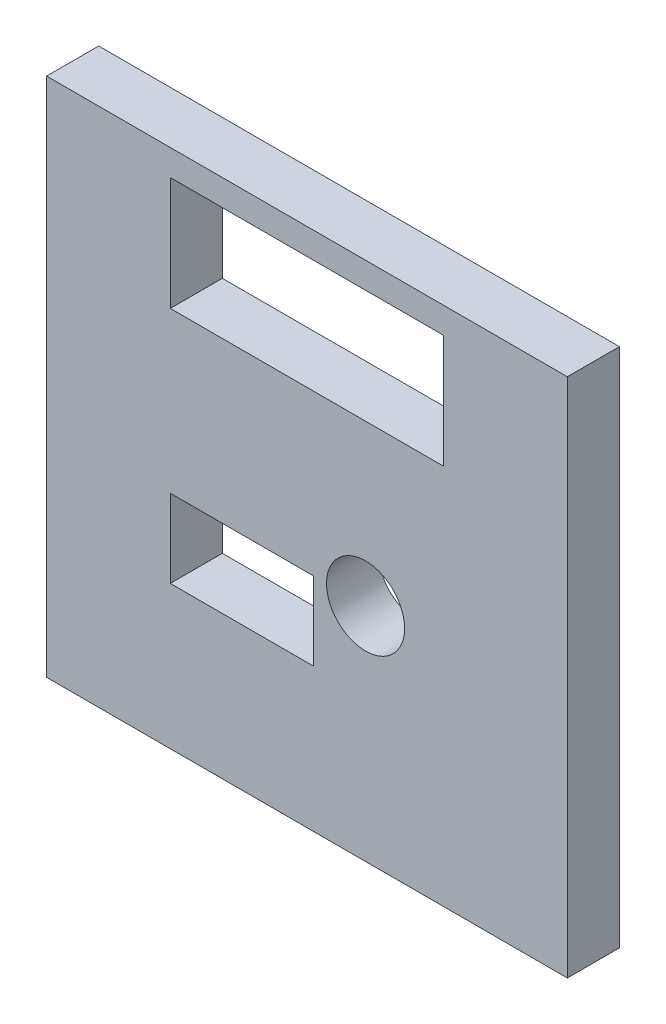
ISO-10303-21;
HEADER;
FILE_DESCRIPTION(('STEP AP214'),'2;1');
FILE_NAME('part.step','',(''),(''),'','','');
FILE_SCHEMA(('AUTOMOTIVE_DESIGN { 1 0 10303 214 1 1 1 1 }'));
ENDSEC;
DATA;
#1=APPLICATION_CONTEXT('core data for automotive mechanical design processes');
#2=APPLICATION_PROTOCOL_DEFINITION('international standard','automotive_design',2000,#1);
#3=PRODUCT_CONTEXT('',#1,'mechanical');
#4=PRODUCT('Part','Part','',(#3));
#5=PRODUCT_RELATED_PRODUCT_CATEGORY('part','',(#4));
#6=PRODUCT_DEFINITION_FORMATION('','',#4);
#7=PRODUCT_DEFINITION_CONTEXT('part definition',#1,'design');
#8=PRODUCT_DEFINITION('design','',#6,#7);
#9=PRODUCT_DEFINITION_SHAPE('','',#8);
#10=(LENGTH_UNIT() NAMED_UNIT(*) SI_UNIT(.MILLI.,.METRE.));
#11=(NAMED_UNIT(*) PLANE_ANGLE_UNIT() SI_UNIT($,.RADIAN.));
#12=(NAMED_UNIT(*) SI_UNIT($,.STERADIAN.) SOLID_ANGLE_UNIT());
#13=UNCERTAINTY_MEASURE_WITH_UNIT(LENGTH_MEASURE(1.E-05),#10,'distance_accuracy_value','');
#14=(GEOMETRIC_REPRESENTATION_CONTEXT(3) GLOBAL_UNCERTAINTY_ASSIGNED_CONTEXT((#13)) GLOBAL_UNIT_ASSIGNED_CONTEXT((#10,
#11,#12)) REPRESENTATION_CONTEXT('',''));
#15=CARTESIAN_POINT('',(0.,0.,0.));
#16=DIRECTION('',(0.,0.,1.));
#17=DIRECTION('',(1.,0.,0.));
#18=AXIS2_PLACEMENT_3D('',#15,#16,#17);
#19=CARTESIAN_POINT('',(0.,0.,2.));
#20=DIRECTION('',(0.,0.,1.));
#21=DIRECTION('',(1.,0.,0.));
#22=AXIS2_PLACEMENT_3D('',#19,#20,#21);
#23=PLANE('',#22);
#24=CARTESIAN_POINT('',(2.25,-1.5,2.));
#25=DIRECTION('',(0.,0.,1.));
#26=DIRECTION('',(1.,0.,0.));
#27=AXIS2_PLACEMENT_3D('',#24,#25,#26);
#28=CIRCLE('',#27,1.5);
#29=CARTESIAN_POINT('',(3.75,-1.5,2.));
#30=VERTEX_POINT('',#29);
#31=EDGE_CURVE('E227',#30,#30,#28,.T.);
#32=ORIENTED_EDGE('',*,*,#31,.F.);
#33=EDGE_LOOP('',(#32));
#34=FACE_BOUND('',#33,.T.);
#35=DIRECTION('',(0.,1.,0.));
#36=VECTOR('',#35,1.);
#37=CARTESIAN_POINT('',(0.249999999999999,0.,2.));
#38=LINE('',#37,#36);
#39=CARTESIAN_POINT('',(0.249999999999999,-4.5,2.));
#40=VERTEX_POINT('',#39);
#41=CARTESIAN_POINT('',(0.249999999999999,-1.5,2.));
#42=VERTEX_POINT('',#41);
#43=EDGE_CURVE('E53',#40,#42,#38,.T.);
#44=ORIENTED_EDGE('',*,*,#43,.F.);
#45=DIRECTION('',(-1.,0.,0.));
#46=VECTOR('',#45,1.);
#47=CARTESIAN_POINT('',(0.,-4.5,2.));
#48=LINE('',#47,#46);
#49=CARTESIAN_POINT('',(-5.25,-4.5,2.));
#50=VERTEX_POINT('',#49);
#51=EDGE_CURVE('E145',#40,#50,#48,.T.);
#52=ORIENTED_EDGE('',*,*,#51,.T.);
#53=DIRECTION('',(0.,1.,0.));
#54=VECTOR('',#53,1.);
#55=CARTESIAN_POINT('',(-5.25,0.,2.));
#56=LINE('',#55,#54);
#57=CARTESIAN_POINT('',(-5.25,-1.5,2.));
#58=VERTEX_POINT('',#57);
#59=EDGE_CURVE('E130',#50,#58,#56,.T.);
#60=ORIENTED_EDGE('',*,*,#59,.T.);
#61=DIRECTION('',(-1.,0.,0.));
#62=VECTOR('',#61,1.);
#63=CARTESIAN_POINT('',(0.,-1.5,2.));
#64=LINE('',#63,#62);
#65=EDGE_CURVE('E139',#42,#58,#64,.T.);
#66=ORIENTED_EDGE('',*,*,#65,.F.);
#67=EDGE_LOOP('',(#44,#52,#60,#66));
#68=FACE_BOUND('',#67,.T.);
#69=DIRECTION('',(0.,-1.,0.));
#70=VECTOR('',#69,1.);
#71=CARTESIAN_POINT('',(-10.,-10.,2.));
#72=LINE('',#71,#70);
#73=CARTESIAN_POINT('',(-10.,10.,2.));
#74=VERTEX_POINT('',#73);
#75=CARTESIAN_POINT('',(-10.,-10.,2.));
#76=VERTEX_POINT('',#75);
#77=EDGE_CURVE('E176',#74,#76,#72,.T.);
#78=ORIENTED_EDGE('',*,*,#77,.T.);
#79=DIRECTION('',(1.,0.,0.));
#80=VECTOR('',#79,1.);
#81=CARTESIAN_POINT('',(10.,-10.,2.));
#82=LINE('',#81,#80);
#83=CARTESIAN_POINT('',(10.,-10.,2.));
#84=VERTEX_POINT('',#83);
#85=EDGE_CURVE('E179',#76,#84,#82,.T.);
#86=ORIENTED_EDGE('',*,*,#85,.T.);
#87=DIRECTION('',(0.,1.,0.));
#88=VECTOR('',#87,1.);
#89=CARTESIAN_POINT('',(10.,-10.,2.));
#90=LINE('',#89,#88);
#91=CARTESIAN_POINT('',(10.,10.,2.));
#92=VERTEX_POINT('',#91);
#93=EDGE_CURVE('E182',#84,#92,#90,.T.);
#94=ORIENTED_EDGE('',*,*,#93,.T.);
#95=DIRECTION('',(-1.,0.,0.));
#96=VECTOR('',#95,1.);
#97=CARTESIAN_POINT('',(10.,10.,2.));
#98=LINE('',#97,#96);
#99=EDGE_CURVE('E184',#92,#74,#98,.T.);
#100=ORIENTED_EDGE('',*,*,#99,.T.);
#101=EDGE_LOOP('',(#78,#86,#94,#100));
#102=FACE_BOUND('',#101,.T.);
#103=DIRECTION('',(0.,1.,0.));
#104=VECTOR('',#103,1.);
#105=CARTESIAN_POINT('',(5.25,0.,2.));
#106=LINE('',#105,#104);
#107=CARTESIAN_POINT('',(5.25,4.64644109275543,2.));
#108=VERTEX_POINT('',#107);
#109=CARTESIAN_POINT('',(5.25,9.,2.));
#110=VERTEX_POINT('',#109);
#111=EDGE_CURVE('E157',#108,#110,#106,.T.);
#112=ORIENTED_EDGE('',*,*,#111,.F.);
#113=DIRECTION('',(-1.,0.,0.));
#114=VECTOR('',#113,1.);
#115=CARTESIAN_POINT('',(0.,4.64644109275543,2.));
#116=LINE('',#115,#114);
#117=CARTESIAN_POINT('',(-5.25,4.64644109275543,2.));
#118=VERTEX_POINT('',#117);
#119=EDGE_CURVE('E152',#108,#118,#116,.T.);
#120=ORIENTED_EDGE('',*,*,#119,.T.);
#121=DIRECTION('',(0.,1.,0.));
#122=VECTOR('',#121,1.);
#123=CARTESIAN_POINT('',(-5.25,0.,2.));
#124=LINE('',#123,#122);
#125=CARTESIAN_POINT('',(-5.25,9.,2.));
#126=VERTEX_POINT('',#125);
#127=EDGE_CURVE('E163',#118,#126,#124,.T.);
#128=ORIENTED_EDGE('',*,*,#127,.T.);
#129=DIRECTION('',(-1.,0.,0.));
#130=VECTOR('',#129,1.);
#131=CARTESIAN_POINT('',(0.,9.,2.));
#132=LINE('',#131,#130);
#133=EDGE_CURVE('E160',#110,#126,#132,.T.);
#134=ORIENTED_EDGE('',*,*,#133,.F.);
#135=EDGE_LOOP('',(#112,#120,#128,#134));
#136=FACE_BOUND('',#135,.T.);
#137=ADVANCED_FACE('F37',(#34,#68,#102,#136),#23,.T.);
#138=CARTESIAN_POINT('',(0.,0.,0.));
#139=DIRECTION('',(0.,0.,1.));
#140=DIRECTION('',(1.,0.,0.));
#141=AXIS2_PLACEMENT_3D('',#138,#139,#140);
#142=PLANE('',#141);
#143=CARTESIAN_POINT('',(2.25,-1.5,0.));
#144=DIRECTION('',(0.,0.,1.));
#145=DIRECTION('',(1.,0.,0.));
#146=AXIS2_PLACEMENT_3D('',#143,#144,#145);
#147=CIRCLE('',#146,1.5);
#148=CARTESIAN_POINT('',(3.75,-1.5,0.));
#149=VERTEX_POINT('',#148);
#150=EDGE_CURVE('E41',#149,#149,#147,.T.);
#151=ORIENTED_EDGE('',*,*,#150,.T.);
#152=EDGE_LOOP('',(#151));
#153=FACE_BOUND('',#152,.T.);
#154=DIRECTION('',(-1.,0.,0.));
#155=VECTOR('',#154,1.);
#156=CARTESIAN_POINT('',(0.,-4.5,0.));
#157=LINE('',#156,#155);
#158=CARTESIAN_POINT('',(0.249999999999999,-4.5,0.));
#159=VERTEX_POINT('',#158);
#160=CARTESIAN_POINT('',(-5.25,-4.5,0.));
#161=VERTEX_POINT('',#160);
#162=EDGE_CURVE('E46',#159,#161,#157,.T.);
#163=ORIENTED_EDGE('',*,*,#162,.F.);
#164=DIRECTION('',(0.,1.,0.));
#165=VECTOR('',#164,1.);
#166=CARTESIAN_POINT('',(0.249999999999999,0.,0.));
#167=LINE('',#166,#165);
#168=CARTESIAN_POINT('',(0.249999999999999,-1.5,0.));
#169=VERTEX_POINT('',#168);
#170=EDGE_CURVE('E11',#159,#169,#167,.T.);
#171=ORIENTED_EDGE('',*,*,#170,.T.);
#172=DIRECTION('',(-1.,0.,0.));
#173=VECTOR('',#172,1.);
#174=CARTESIAN_POINT('',(0.,-1.5,0.));
#175=LINE('',#174,#173);
#176=CARTESIAN_POINT('',(-5.25,-1.5,0.));
#177=VERTEX_POINT('',#176);
#178=EDGE_CURVE('E215',#169,#177,#175,.T.);
#179=ORIENTED_EDGE('',*,*,#178,.T.);
#180=DIRECTION('',(0.,1.,0.));
#181=VECTOR('',#180,1.);
#182=CARTESIAN_POINT('',(-5.25,0.,0.));
#183=LINE('',#182,#181);
#184=EDGE_CURVE('E133',#161,#177,#183,.T.);
#185=ORIENTED_EDGE('',*,*,#184,.F.);
#186=EDGE_LOOP('',(#163,#171,#179,#185));
#187=FACE_BOUND('',#186,.T.);
#188=DIRECTION('',(0.,-1.,0.));
#189=VECTOR('',#188,1.);
#190=CARTESIAN_POINT('',(-10.,-10.,0.));
#191=LINE('',#190,#189);
#192=CARTESIAN_POINT('',(-10.,10.,0.));
#193=VERTEX_POINT('',#192);
#194=CARTESIAN_POINT('',(-10.,-10.,0.));
#195=VERTEX_POINT('',#194);
#196=EDGE_CURVE('E169',#193,#195,#191,.T.);
#197=ORIENTED_EDGE('',*,*,#196,.F.);
#198=DIRECTION('',(-1.,0.,0.));
#199=VECTOR('',#198,1.);
#200=CARTESIAN_POINT('',(10.,10.,0.));
#201=LINE('',#200,#199);
#202=CARTESIAN_POINT('',(10.,10.,0.));
#203=VERTEX_POINT('',#202);
#204=EDGE_CURVE('E180',#203,#193,#201,.T.);
#205=ORIENTED_EDGE('',*,*,#204,.F.);
#206=DIRECTION('',(0.,1.,0.));
#207=VECTOR('',#206,1.);
#208=CARTESIAN_POINT('',(10.,-10.,0.));
#209=LINE('',#208,#207);
#210=CARTESIAN_POINT('',(10.,-10.,0.));
#211=VERTEX_POINT('',#210);
#212=EDGE_CURVE('E191',#211,#203,#209,.T.);
#213=ORIENTED_EDGE('',*,*,#212,.F.);
#214=DIRECTION('',(1.,0.,0.));
#215=VECTOR('',#214,1.);
#216=CARTESIAN_POINT('',(10.,-10.,0.));
#217=LINE('',#216,#215);
#218=EDGE_CURVE('E189',#195,#211,#217,.T.);
#219=ORIENTED_EDGE('',*,*,#218,.F.);
#220=EDGE_LOOP('',(#197,#205,#213,#219));
#221=FACE_BOUND('',#220,.T.);
#222=DIRECTION('',(-1.,0.,0.));
#223=VECTOR('',#222,1.);
#224=CARTESIAN_POINT('',(0.,4.64644109275543,0.));
#225=LINE('',#224,#223);
#226=CARTESIAN_POINT('',(5.25,4.64644109275543,0.));
#227=VERTEX_POINT('',#226);
#228=CARTESIAN_POINT('',(-5.25,4.64644109275543,0.));
#229=VERTEX_POINT('',#228);
#230=EDGE_CURVE('E213',#227,#229,#225,.T.);
#231=ORIENTED_EDGE('',*,*,#230,.F.);
#232=DIRECTION('',(0.,1.,0.));
#233=VECTOR('',#232,1.);
#234=CARTESIAN_POINT('',(5.25,0.,0.));
#235=LINE('',#234,#233);
#236=CARTESIAN_POINT('',(5.25,9.,0.));
#237=VERTEX_POINT('',#236);
#238=EDGE_CURVE('E205',#227,#237,#235,.T.);
#239=ORIENTED_EDGE('',*,*,#238,.T.);
#240=DIRECTION('',(-1.,0.,0.));
#241=VECTOR('',#240,1.);
#242=CARTESIAN_POINT('',(0.,9.,0.));
#243=LINE('',#242,#241);
#244=CARTESIAN_POINT('',(-5.25,9.,0.));
#245=VERTEX_POINT('',#244);
#246=EDGE_CURVE('E208',#237,#245,#243,.T.);
#247=ORIENTED_EDGE('',*,*,#246,.T.);
#248=DIRECTION('',(0.,1.,0.));
#249=VECTOR('',#248,1.);
#250=CARTESIAN_POINT('',(-5.25,0.,0.));
#251=LINE('',#250,#249);
#252=EDGE_CURVE('E211',#229,#245,#251,.T.);
#253=ORIENTED_EDGE('',*,*,#252,.F.);
#254=EDGE_LOOP('',(#231,#239,#247,#253));
#255=FACE_BOUND('',#254,.T.);
#256=ADVANCED_FACE('F223',(#153,#187,#221,#255),#142,.F.);
#257=CARTESIAN_POINT('',(-10.,-10.,2.));
#258=DIRECTION('',(1.,0.,0.));
#259=DIRECTION('',(0.,0.,-1.));
#260=AXIS2_PLACEMENT_3D('',#257,#258,#259);
#261=PLANE('',#260);
#262=ORIENTED_EDGE('',*,*,#196,.T.);
#263=DIRECTION('',(0.,0.,-1.));
#264=VECTOR('',#263,1.);
#265=CARTESIAN_POINT('',(-10.,-10.,2.));
#266=LINE('',#265,#264);
#267=EDGE_CURVE('E202',#76,#195,#266,.T.);
#268=ORIENTED_EDGE('',*,*,#267,.F.);
#269=ORIENTED_EDGE('',*,*,#77,.F.);
#270=DIRECTION('',(0.,0.,-1.));
#271=VECTOR('',#270,1.);
#272=CARTESIAN_POINT('',(-10.,10.,2.));
#273=LINE('',#272,#271);
#274=EDGE_CURVE('E186',#74,#193,#273,.T.);
#275=ORIENTED_EDGE('',*,*,#274,.T.);
#276=EDGE_LOOP('',(#262,#268,#269,#275));
#277=FACE_BOUND('',#276,.T.);
#278=ADVANCED_FACE('F39',(#277),#261,.F.);
#279=CARTESIAN_POINT('',(10.,-10.,2.));
#280=DIRECTION('',(0.,1.,0.));
#281=DIRECTION('',(-1.,0.,0.));
#282=AXIS2_PLACEMENT_3D('',#279,#280,#281);
#283=PLANE('',#282);
#284=ORIENTED_EDGE('',*,*,#218,.T.);
#285=DIRECTION('',(0.,0.,-1.));
#286=VECTOR('',#285,1.);
#287=CARTESIAN_POINT('',(10.,-10.,2.));
#288=LINE('',#287,#286);
#289=EDGE_CURVE('E199',#84,#211,#288,.T.);
#290=ORIENTED_EDGE('',*,*,#289,.F.);
#291=ORIENTED_EDGE('',*,*,#85,.F.);
#292=ORIENTED_EDGE('',*,*,#267,.T.);
#293=EDGE_LOOP('',(#284,#290,#291,#292));
#294=FACE_BOUND('',#293,.T.);
#295=ADVANCED_FACE('F252',(#294),#283,.F.);
#296=CARTESIAN_POINT('',(10.,-10.,2.));
#297=DIRECTION('',(-1.,0.,0.));
#298=DIRECTION('',(0.,0.,1.));
#299=AXIS2_PLACEMENT_3D('',#296,#297,#298);
#300=PLANE('',#299);
#301=ORIENTED_EDGE('',*,*,#212,.T.);
#302=DIRECTION('',(0.,0.,-1.));
#303=VECTOR('',#302,1.);
#304=CARTESIAN_POINT('',(10.,10.,2.));
#305=LINE('',#304,#303);
#306=EDGE_CURVE('E196',#92,#203,#305,.T.);
#307=ORIENTED_EDGE('',*,*,#306,.F.);
#308=ORIENTED_EDGE('',*,*,#93,.F.);
#309=ORIENTED_EDGE('',*,*,#289,.T.);
#310=EDGE_LOOP('',(#301,#307,#308,#309));
#311=FACE_BOUND('',#310,.T.);
#312=ADVANCED_FACE('F249',(#311),#300,.F.);
#313=CARTESIAN_POINT('',(10.,10.,2.));
#314=DIRECTION('',(0.,-1.,0.));
#315=DIRECTION('',(1.,0.,0.));
#316=AXIS2_PLACEMENT_3D('',#313,#314,#315);
#317=PLANE('',#316);
#318=ORIENTED_EDGE('',*,*,#204,.T.);
#319=ORIENTED_EDGE('',*,*,#274,.F.);
#320=ORIENTED_EDGE('',*,*,#99,.F.);
#321=ORIENTED_EDGE('',*,*,#306,.T.);
#322=EDGE_LOOP('',(#318,#319,#320,#321));
#323=FACE_BOUND('',#322,.T.);
#324=ADVANCED_FACE('F246',(#323),#317,.F.);
#325=CARTESIAN_POINT('',(0.,4.64644109275543,-8.));
#326=DIRECTION('',(0.,1.,0.));
#327=DIRECTION('',(0.,0.,1.));
#328=AXIS2_PLACEMENT_3D('',#325,#326,#327);
#329=PLANE('',#328);
#330=ORIENTED_EDGE('',*,*,#230,.T.);
#331=DIRECTION('',(0.,0.,1.));
#332=VECTOR('',#331,1.);
#333=CARTESIAN_POINT('',(-5.25,4.64644109275543,-8.));
#334=LINE('',#333,#332);
#335=EDGE_CURVE('E167',#229,#118,#334,.T.);
#336=ORIENTED_EDGE('',*,*,#335,.T.);
#337=ORIENTED_EDGE('',*,*,#119,.F.);
#338=DIRECTION('',(0.,0.,1.));
#339=VECTOR('',#338,1.);
#340=CARTESIAN_POINT('',(5.25,4.64644109275543,-8.));
#341=LINE('',#340,#339);
#342=EDGE_CURVE('E166',#227,#108,#341,.T.);
#343=ORIENTED_EDGE('',*,*,#342,.F.);
#344=EDGE_LOOP('',(#330,#336,#337,#343));
#345=FACE_BOUND('',#344,.T.);
#346=ADVANCED_FACE('F243',(#345),#329,.T.);
#347=CARTESIAN_POINT('',(-5.25,0.,-8.));
#348=DIRECTION('',(1.,0.,0.));
#349=DIRECTION('',(0.,0.,-1.));
#350=AXIS2_PLACEMENT_3D('',#347,#348,#349);
#351=PLANE('',#350);
#352=ORIENTED_EDGE('',*,*,#252,.T.);
#353=DIRECTION('',(0.,0.,1.));
#354=VECTOR('',#353,1.);
#355=CARTESIAN_POINT('',(-5.25,9.,-8.));
#356=LINE('',#355,#354);
#357=EDGE_CURVE('E170',#245,#126,#356,.T.);
#358=ORIENTED_EDGE('',*,*,#357,.T.);
#359=ORIENTED_EDGE('',*,*,#127,.F.);
#360=ORIENTED_EDGE('',*,*,#335,.F.);
#361=EDGE_LOOP('',(#352,#358,#359,#360));
#362=FACE_BOUND('',#361,.T.);
#363=ADVANCED_FACE('F284',(#362),#351,.T.);
#364=CARTESIAN_POINT('',(0.,9.,-8.));
#365=DIRECTION('',(0.,1.,0.));
#366=DIRECTION('',(0.,0.,1.));
#367=AXIS2_PLACEMENT_3D('',#364,#365,#366);
#368=PLANE('',#367);
#369=DIRECTION('',(0.,0.,1.));
#370=VECTOR('',#369,1.);
#371=CARTESIAN_POINT('',(5.25,9.,-8.));
#372=LINE('',#371,#370);
#373=EDGE_CURVE('E172',#237,#110,#372,.T.);
#374=ORIENTED_EDGE('',*,*,#373,.T.);
#375=ORIENTED_EDGE('',*,*,#133,.T.);
#376=ORIENTED_EDGE('',*,*,#357,.F.);
#377=ORIENTED_EDGE('',*,*,#246,.F.);
#378=EDGE_LOOP('',(#374,#375,#376,#377));
#379=FACE_BOUND('',#378,.T.);
#380=ADVANCED_FACE('F287',(#379),#368,.F.);
#381=CARTESIAN_POINT('',(5.25,0.,-8.));
#382=DIRECTION('',(1.,0.,0.));
#383=DIRECTION('',(0.,0.,-1.));
#384=AXIS2_PLACEMENT_3D('',#381,#382,#383);
#385=PLANE('',#384);
#386=ORIENTED_EDGE('',*,*,#342,.T.);
#387=ORIENTED_EDGE('',*,*,#111,.T.);
#388=ORIENTED_EDGE('',*,*,#373,.F.);
#389=ORIENTED_EDGE('',*,*,#238,.F.);
#390=EDGE_LOOP('',(#386,#387,#388,#389));
#391=FACE_BOUND('',#390,.T.);
#392=ADVANCED_FACE('F275',(#391),#385,.F.);
#393=CARTESIAN_POINT('',(0.249999999999999,0.,-8.));
#394=DIRECTION('',(1.,0.,0.));
#395=DIRECTION('',(0.,0.,-1.));
#396=AXIS2_PLACEMENT_3D('',#393,#394,#395);
#397=PLANE('',#396);
#398=DIRECTION('',(0.,0.,1.));
#399=VECTOR('',#398,1.);
#400=CARTESIAN_POINT('',(0.249999999999999,-4.5,-8.));
#401=LINE('',#400,#399);
#402=EDGE_CURVE('E150',#159,#40,#401,.T.);
#403=ORIENTED_EDGE('',*,*,#402,.T.);
#404=ORIENTED_EDGE('',*,*,#43,.T.);
#405=DIRECTION('',(0.,0.,1.));
#406=VECTOR('',#405,1.);
#407=CARTESIAN_POINT('',(0.249999999999999,-1.5,-8.));
#408=LINE('',#407,#406);
#409=EDGE_CURVE('E136',#169,#42,#408,.T.);
#410=ORIENTED_EDGE('',*,*,#409,.F.);
#411=ORIENTED_EDGE('',*,*,#170,.F.);
#412=EDGE_LOOP('',(#403,#404,#410,#411));
#413=FACE_BOUND('',#412,.T.);
#414=ADVANCED_FACE('F225',(#413),#397,.F.);
#415=CARTESIAN_POINT('',(0.,-4.5,-8.));
#416=DIRECTION('',(0.,1.,0.));
#417=DIRECTION('',(0.,0.,1.));
#418=AXIS2_PLACEMENT_3D('',#415,#416,#417);
#419=PLANE('',#418);
#420=ORIENTED_EDGE('',*,*,#162,.T.);
#421=DIRECTION('',(0.,0.,1.));
#422=VECTOR('',#421,1.);
#423=CARTESIAN_POINT('',(-5.25,-4.5,-8.));
#424=LINE('',#423,#422);
#425=EDGE_CURVE('E135',#161,#50,#424,.T.);
#426=ORIENTED_EDGE('',*,*,#425,.T.);
#427=ORIENTED_EDGE('',*,*,#51,.F.);
#428=ORIENTED_EDGE('',*,*,#402,.F.);
#429=EDGE_LOOP('',(#420,#426,#427,#428));
#430=FACE_BOUND('',#429,.T.);
#431=ADVANCED_FACE('F221',(#430),#419,.T.);
#432=CARTESIAN_POINT('',(-5.25,0.,-8.));
#433=DIRECTION('',(1.,0.,0.));
#434=DIRECTION('',(0.,0.,-1.));
#435=AXIS2_PLACEMENT_3D('',#432,#433,#434);
#436=PLANE('',#435);
#437=ORIENTED_EDGE('',*,*,#184,.T.);
#438=DIRECTION('',(0.,0.,1.));
#439=VECTOR('',#438,1.);
#440=CARTESIAN_POINT('',(-5.25,-1.5,-8.));
#441=LINE('',#440,#439);
#442=EDGE_CURVE('E61',#177,#58,#441,.T.);
#443=ORIENTED_EDGE('',*,*,#442,.T.);
#444=ORIENTED_EDGE('',*,*,#59,.F.);
#445=ORIENTED_EDGE('',*,*,#425,.F.);
#446=EDGE_LOOP('',(#437,#443,#444,#445));
#447=FACE_BOUND('',#446,.T.);
#448=ADVANCED_FACE('F127',(#447),#436,.T.);
#449=CARTESIAN_POINT('',(0.,-1.5,-8.));
#450=DIRECTION('',(0.,1.,0.));
#451=DIRECTION('',(-1.,0.,0.));
#452=AXIS2_PLACEMENT_3D('',#449,#450,#451);
#453=PLANE('',#452);
#454=ORIENTED_EDGE('',*,*,#409,.T.);
#455=ORIENTED_EDGE('',*,*,#65,.T.);
#456=ORIENTED_EDGE('',*,*,#442,.F.);
#457=ORIENTED_EDGE('',*,*,#178,.F.);
#458=EDGE_LOOP('',(#454,#455,#456,#457));
#459=FACE_BOUND('',#458,.T.);
#460=ADVANCED_FACE('F140',(#459),#453,.F.);
#461=CARTESIAN_POINT('',(2.25,-1.5,-8.));
#462=DIRECTION('',(0.,0.,1.));
#463=DIRECTION('',(1.,0.,0.));
#464=AXIS2_PLACEMENT_3D('',#461,#462,#463);
#465=CYLINDRICAL_SURFACE('',#464,1.5);
#466=ORIENTED_EDGE('',*,*,#31,.T.);
#467=EDGE_LOOP('',(#466));
#468=FACE_BOUND('',#467,.T.);
#469=ORIENTED_EDGE('',*,*,#150,.F.);
#470=EDGE_LOOP('',(#469));
#471=FACE_BOUND('',#470,.T.);
#472=ADVANCED_FACE('F232',(#468,#471),#465,.F.);
#473=CLOSED_SHELL('',(#137,#256,#278,#295,#312,#324,#346,#363,#380,#392,#414,#431,#448,#460,#472));
#474=MANIFOLD_SOLID_BREP('B2',#473);
#475=ADVANCED_BREP_SHAPE_REPRESENTATION('',(#18,#474),#14);
#476=SHAPE_DEFINITION_REPRESENTATION(#9,#475);
ENDSEC;
END-ISO-10303-21;
